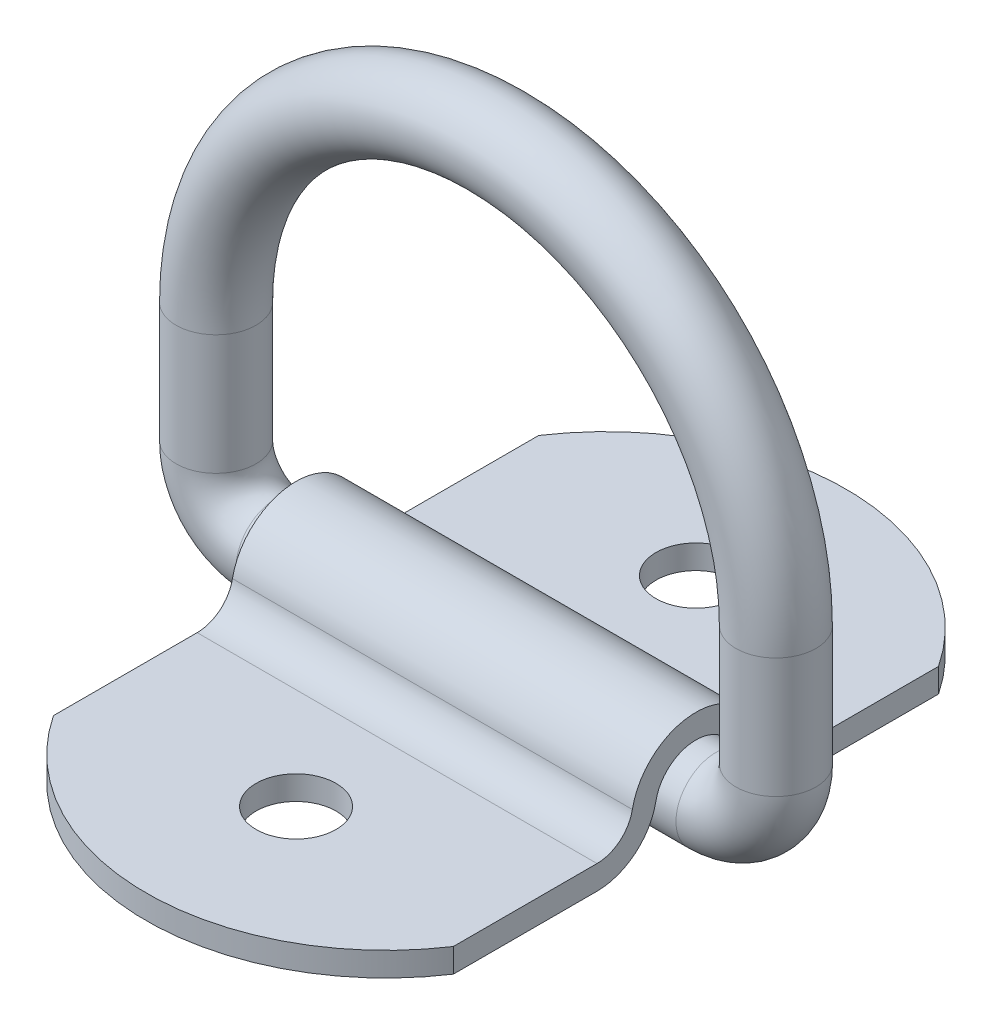
ISO-10303-21;
HEADER;
FILE_DESCRIPTION(('STEP AP214'),'2;1');
FILE_NAME('part.step','',(''),(''),'','','');
FILE_SCHEMA(('AUTOMOTIVE_DESIGN { 1 0 10303 214 1 1 1 1 }'));
ENDSEC;
DATA;
#1=APPLICATION_CONTEXT('core data for automotive mechanical design processes');
#2=APPLICATION_PROTOCOL_DEFINITION('international standard','automotive_design',2000,#1);
#3=PRODUCT_CONTEXT('',#1,'mechanical');
#4=PRODUCT('Part','Part','',(#3));
#5=PRODUCT_RELATED_PRODUCT_CATEGORY('part','',(#4));
#6=PRODUCT_DEFINITION_FORMATION('','',#4);
#7=PRODUCT_DEFINITION_CONTEXT('part definition',#1,'design');
#8=PRODUCT_DEFINITION('design','',#6,#7);
#9=PRODUCT_DEFINITION_SHAPE('','',#8);
#10=(LENGTH_UNIT() NAMED_UNIT(*) SI_UNIT(.MILLI.,.METRE.));
#11=(NAMED_UNIT(*) PLANE_ANGLE_UNIT() SI_UNIT($,.RADIAN.));
#12=(NAMED_UNIT(*) SI_UNIT($,.STERADIAN.) SOLID_ANGLE_UNIT());
#13=UNCERTAINTY_MEASURE_WITH_UNIT(LENGTH_MEASURE(1.E-05),#10,'distance_accuracy_value','');
#14=(GEOMETRIC_REPRESENTATION_CONTEXT(3) GLOBAL_UNCERTAINTY_ASSIGNED_CONTEXT((#13)) GLOBAL_UNIT_ASSIGNED_CONTEXT((#10,
#11,#12)) REPRESENTATION_CONTEXT('',''));
#15=CARTESIAN_POINT('',(0.,0.,0.));
#16=DIRECTION('',(0.,0.,1.));
#17=DIRECTION('',(1.,0.,0.));
#18=AXIS2_PLACEMENT_3D('',#15,#16,#17);
#19=CARTESIAN_POINT('',(15.875,-3.2385,27.78125));
#20=DIRECTION('',(0.,1.,0.));
#21=DIRECTION('',(0.,0.,1.));
#22=AXIS2_PLACEMENT_3D('',#19,#20,#21);
#23=PLANE('',#22);
#24=CARTESIAN_POINT('',(0.,-3.2385,15.875));
#25=DIRECTION('',(0.,-1.,0.));
#26=DIRECTION('',(0.,0.,-1.));
#27=AXIS2_PLACEMENT_3D('',#24,#25,#26);
#28=CIRCLE('',#27,3.175);
#29=CARTESIAN_POINT('',(0.,-3.2385,12.7));
#30=VERTEX_POINT('',#29);
#31=EDGE_CURVE('E217',#30,#30,#28,.T.);
#32=ORIENTED_EDGE('',*,*,#31,.F.);
#33=EDGE_LOOP('',(#32));
#34=FACE_BOUND('',#33,.T.);
#35=CARTESIAN_POINT('',(0.,-3.2385,8.73125));
#36=DIRECTION('',(0.,1.,0.));
#37=DIRECTION('',(0.,0.,-1.));
#38=AXIS2_PLACEMENT_3D('',#35,#36,#37);
#39=CIRCLE('',#38,19.05);
#40=CARTESIAN_POINT('',(-15.875,-3.2385,19.2615337093784));
#41=VERTEX_POINT('',#40);
#42=CARTESIAN_POINT('',(15.875,-3.2385,19.2615337093784));
#43=VERTEX_POINT('',#42);
#44=EDGE_CURVE('E216',#41,#43,#39,.T.);
#45=ORIENTED_EDGE('',*,*,#44,.F.);
#46=DIRECTION('',(0.,0.,-1.));
#47=VECTOR('',#46,1.);
#48=CARTESIAN_POINT('',(-15.875,-3.2385,27.78125));
#49=LINE('',#48,#47);
#50=CARTESIAN_POINT('',(-15.875,-3.2385,7.85451621680165));
#51=VERTEX_POINT('',#50);
#52=EDGE_CURVE('E170',#41,#51,#49,.T.);
#53=ORIENTED_EDGE('',*,*,#52,.T.);
#54=DIRECTION('',(-1.,0.,0.));
#55=VECTOR('',#54,1.);
#56=CARTESIAN_POINT('',(15.875,-3.2385,7.85451621680165));
#57=LINE('',#56,#55);
#58=CARTESIAN_POINT('',(15.875,-3.2385,7.85451621680165));
#59=VERTEX_POINT('',#58);
#60=EDGE_CURVE('E210',#59,#51,#57,.T.);
#61=ORIENTED_EDGE('',*,*,#60,.F.);
#62=DIRECTION('',(0.,0.,-1.));
#63=VECTOR('',#62,1.);
#64=CARTESIAN_POINT('',(15.875,-3.2385,27.78125));
#65=LINE('',#64,#63);
#66=EDGE_CURVE('E190',#43,#59,#65,.T.);
#67=ORIENTED_EDGE('',*,*,#66,.F.);
#68=EDGE_LOOP('',(#45,#53,#61,#67));
#69=FACE_BOUND('',#68,.T.);
#70=ADVANCED_FACE('F46',(#34,#69),#23,.F.);
#71=CARTESIAN_POINT('',(15.875,1.524,7.85451621680165));
#72=DIRECTION('',(-1.,0.,0.));
#73=DIRECTION('',(0.,0.,1.));
#74=AXIS2_PLACEMENT_3D('',#71,#72,#73);
#75=CYLINDRICAL_SURFACE('',#74,4.7625);
#76=CARTESIAN_POINT('',(-15.875,1.524,7.85451621680165));
#77=DIRECTION('',(1.,0.,0.));
#78=DIRECTION('',(0.,0.,-1.));
#79=AXIS2_PLACEMENT_3D('',#76,#77,#78);
#80=CIRCLE('',#79,4.7625);
#81=CARTESIAN_POINT('',(-15.875,0.616857142857142,3.1792089448959));
#82=VERTEX_POINT('',#81);
#83=EDGE_CURVE('E172',#51,#82,#80,.T.);
#84=ORIENTED_EDGE('',*,*,#83,.T.);
#85=DIRECTION('',(-1.,0.,0.));
#86=VECTOR('',#85,1.);
#87=CARTESIAN_POINT('',(15.875,0.616857142857142,3.1792089448959));
#88=LINE('',#87,#86);
#89=CARTESIAN_POINT('',(15.875,0.616857142857142,3.1792089448959));
#90=VERTEX_POINT('',#89);
#91=EDGE_CURVE('E207',#90,#82,#88,.T.);
#92=ORIENTED_EDGE('',*,*,#91,.F.);
#93=CARTESIAN_POINT('',(15.875,1.524,7.85451621680165));
#94=DIRECTION('',(1.,0.,0.));
#95=DIRECTION('',(0.,0.,-1.));
#96=AXIS2_PLACEMENT_3D('',#93,#94,#95);
#97=CIRCLE('',#96,4.7625);
#98=EDGE_CURVE('E237',#59,#90,#97,.T.);
#99=ORIENTED_EDGE('',*,*,#98,.F.);
#100=ORIENTED_EDGE('',*,*,#60,.T.);
#101=EDGE_LOOP('',(#84,#92,#99,#100));
#102=FACE_BOUND('',#101,.T.);
#103=ADVANCED_FACE('F280',(#102),#75,.T.);
#104=CARTESIAN_POINT('',(15.875,0.,0.));
#105=DIRECTION('',(-1.,0.,0.));
#106=DIRECTION('',(0.,0.,1.));
#107=AXIS2_PLACEMENT_3D('',#104,#105,#106);
#108=CYLINDRICAL_SURFACE('',#107,3.2385);
#109=CARTESIAN_POINT('',(-15.875,0.,0.));
#110=DIRECTION('',(-1.,0.,0.));
#111=DIRECTION('',(0.,0.,1.));
#112=AXIS2_PLACEMENT_3D('',#109,#110,#111);
#113=CIRCLE('',#112,3.2385);
#114=CARTESIAN_POINT('',(-15.875,0.61685714285714,-3.17920894489591));
#115=VERTEX_POINT('',#114);
#116=EDGE_CURVE('E174',#82,#115,#113,.T.);
#117=ORIENTED_EDGE('',*,*,#116,.T.);
#118=DIRECTION('',(-1.,0.,0.));
#119=VECTOR('',#118,1.);
#120=CARTESIAN_POINT('',(15.875,0.61685714285714,-3.17920894489591));
#121=LINE('',#120,#119);
#122=CARTESIAN_POINT('',(15.875,0.61685714285714,-3.17920894489591));
#123=VERTEX_POINT('',#122);
#124=EDGE_CURVE('E204',#123,#115,#121,.T.);
#125=ORIENTED_EDGE('',*,*,#124,.F.);
#126=CARTESIAN_POINT('',(15.875,0.,0.));
#127=DIRECTION('',(-1.,0.,0.));
#128=DIRECTION('',(0.,0.,1.));
#129=AXIS2_PLACEMENT_3D('',#126,#127,#128);
#130=CIRCLE('',#129,3.2385);
#131=EDGE_CURVE('E157',#90,#123,#130,.T.);
#132=ORIENTED_EDGE('',*,*,#131,.F.);
#133=ORIENTED_EDGE('',*,*,#91,.T.);
#134=EDGE_LOOP('',(#117,#125,#132,#133));
#135=FACE_BOUND('',#134,.T.);
#136=ADVANCED_FACE('F243',(#135),#108,.F.);
#137=CARTESIAN_POINT('',(15.875,1.524,-7.85451621680165));
#138=DIRECTION('',(-1.,0.,0.));
#139=DIRECTION('',(0.,0.,1.));
#140=AXIS2_PLACEMENT_3D('',#137,#138,#139);
#141=CYLINDRICAL_SURFACE('',#140,4.7625);
#142=CARTESIAN_POINT('',(-15.875,1.524,-7.85451621680165));
#143=DIRECTION('',(1.,0.,0.));
#144=DIRECTION('',(0.,0.,1.));
#145=AXIS2_PLACEMENT_3D('',#142,#143,#144);
#146=CIRCLE('',#145,4.7625);
#147=CARTESIAN_POINT('',(-15.875,-3.2385,-7.85451621680165));
#148=VERTEX_POINT('',#147);
#149=EDGE_CURVE('E176',#115,#148,#146,.T.);
#150=ORIENTED_EDGE('',*,*,#149,.T.);
#151=DIRECTION('',(-1.,0.,0.));
#152=VECTOR('',#151,1.);
#153=CARTESIAN_POINT('',(15.875,-3.2385,-7.85451621680165));
#154=LINE('',#153,#152);
#155=CARTESIAN_POINT('',(15.875,-3.2385,-7.85451621680165));
#156=VERTEX_POINT('',#155);
#157=EDGE_CURVE('E202',#156,#148,#154,.T.);
#158=ORIENTED_EDGE('',*,*,#157,.F.);
#159=CARTESIAN_POINT('',(15.875,1.524,-7.85451621680165));
#160=DIRECTION('',(1.,0.,0.));
#161=DIRECTION('',(0.,0.,1.));
#162=AXIS2_PLACEMENT_3D('',#159,#160,#161);
#163=CIRCLE('',#162,4.7625);
#164=EDGE_CURVE('E151',#123,#156,#163,.T.);
#165=ORIENTED_EDGE('',*,*,#164,.F.);
#166=ORIENTED_EDGE('',*,*,#124,.T.);
#167=EDGE_LOOP('',(#150,#158,#165,#166));
#168=FACE_BOUND('',#167,.T.);
#169=ADVANCED_FACE('F247',(#168),#141,.T.);
#170=CARTESIAN_POINT('',(15.875,-3.23849999999999,-27.78125));
#171=DIRECTION('',(0.,1.,0.));
#172=DIRECTION('',(0.,0.,1.));
#173=AXIS2_PLACEMENT_3D('',#170,#171,#172);
#174=PLANE('',#173);
#175=CARTESIAN_POINT('',(0.,-3.2385,-15.875));
#176=DIRECTION('',(0.,-1.,0.));
#177=DIRECTION('',(0.,0.,1.));
#178=AXIS2_PLACEMENT_3D('',#175,#176,#177);
#179=CIRCLE('',#178,3.175);
#180=CARTESIAN_POINT('',(0.,-3.2385,-12.7));
#181=VERTEX_POINT('',#180);
#182=EDGE_CURVE('E220',#181,#181,#179,.T.);
#183=ORIENTED_EDGE('',*,*,#182,.F.);
#184=EDGE_LOOP('',(#183));
#185=FACE_BOUND('',#184,.T.);
#186=DIRECTION('',(0.,0.,-1.));
#187=VECTOR('',#186,1.);
#188=CARTESIAN_POINT('',(-15.875,-3.23849999999999,-27.78125));
#189=LINE('',#188,#187);
#190=CARTESIAN_POINT('',(-15.875,-3.23849999999999,-19.2615337093784));
#191=VERTEX_POINT('',#190);
#192=EDGE_CURVE('E147',#148,#191,#189,.T.);
#193=ORIENTED_EDGE('',*,*,#192,.T.);
#194=CARTESIAN_POINT('',(0.,-3.2385,-8.73125));
#195=DIRECTION('',(0.,1.,0.));
#196=DIRECTION('',(0.,0.,1.));
#197=AXIS2_PLACEMENT_3D('',#194,#195,#196);
#198=CIRCLE('',#197,19.05);
#199=CARTESIAN_POINT('',(15.875,-3.2385,-19.2615337093784));
#200=VERTEX_POINT('',#199);
#201=EDGE_CURVE('E60',#200,#191,#198,.T.);
#202=ORIENTED_EDGE('',*,*,#201,.F.);
#203=DIRECTION('',(0.,0.,-1.));
#204=VECTOR('',#203,1.);
#205=CARTESIAN_POINT('',(15.875,-3.23849999999999,-27.78125));
#206=LINE('',#205,#204);
#207=EDGE_CURVE('E145',#156,#200,#206,.T.);
#208=ORIENTED_EDGE('',*,*,#207,.F.);
#209=ORIENTED_EDGE('',*,*,#157,.T.);
#210=EDGE_LOOP('',(#193,#202,#208,#209));
#211=FACE_BOUND('',#210,.T.);
#212=ADVANCED_FACE('F143',(#185,#211),#174,.F.);
#213=CARTESIAN_POINT('',(15.875,-1.33349999999999,-27.78125));
#214=DIRECTION('',(0.,-1.,0.));
#215=DIRECTION('',(0.,0.,-1.));
#216=AXIS2_PLACEMENT_3D('',#213,#214,#215);
#217=PLANE('',#216);
#218=CARTESIAN_POINT('',(0.,-1.33349999999999,-15.875));
#219=DIRECTION('',(0.,-1.,0.));
#220=DIRECTION('',(0.,0.,-1.));
#221=AXIS2_PLACEMENT_3D('',#218,#219,#220);
#222=CIRCLE('',#221,3.175);
#223=CARTESIAN_POINT('',(0.,-1.33349999999999,-19.05));
#224=VERTEX_POINT('',#223);
#225=EDGE_CURVE('E218',#224,#224,#222,.T.);
#226=ORIENTED_EDGE('',*,*,#225,.T.);
#227=EDGE_LOOP('',(#226));
#228=FACE_BOUND('',#227,.T.);
#229=DIRECTION('',(0.,0.,1.));
#230=VECTOR('',#229,1.);
#231=CARTESIAN_POINT('',(15.875,-1.33349999999999,-27.78125));
#232=LINE('',#231,#230);
#233=CARTESIAN_POINT('',(15.875,-1.33349999999999,-19.2615337093784));
#234=VERTEX_POINT('',#233);
#235=CARTESIAN_POINT('',(15.875,-1.3335,-7.85451621680165));
#236=VERTEX_POINT('',#235);
#237=EDGE_CURVE('E153',#234,#236,#232,.T.);
#238=ORIENTED_EDGE('',*,*,#237,.F.);
#239=CARTESIAN_POINT('',(0.,-1.3335,-8.73125));
#240=DIRECTION('',(0.,-1.,0.));
#241=DIRECTION('',(0.,0.,-1.));
#242=AXIS2_PLACEMENT_3D('',#239,#240,#241);
#243=CIRCLE('',#242,19.05);
#244=CARTESIAN_POINT('',(-15.875,-1.33349999999999,-19.2615337093784));
#245=VERTEX_POINT('',#244);
#246=EDGE_CURVE('E135',#234,#245,#243,.F.);
#247=ORIENTED_EDGE('',*,*,#246,.T.);
#248=DIRECTION('',(0.,0.,1.));
#249=VECTOR('',#248,1.);
#250=CARTESIAN_POINT('',(-15.875,-1.33349999999999,-27.78125));
#251=LINE('',#250,#249);
#252=CARTESIAN_POINT('',(-15.875,-1.3335,-7.85451621680165));
#253=VERTEX_POINT('',#252);
#254=EDGE_CURVE('E179',#245,#253,#251,.T.);
#255=ORIENTED_EDGE('',*,*,#254,.T.);
#256=DIRECTION('',(-1.,0.,0.));
#257=VECTOR('',#256,1.);
#258=CARTESIAN_POINT('',(15.875,-1.3335,-7.85451621680165));
#259=LINE('',#258,#257);
#260=EDGE_CURVE('E199',#236,#253,#259,.T.);
#261=ORIENTED_EDGE('',*,*,#260,.F.);
#262=EDGE_LOOP('',(#238,#247,#255,#261));
#263=FACE_BOUND('',#262,.T.);
#264=ADVANCED_FACE('F253',(#228,#263),#217,.F.);
#265=CARTESIAN_POINT('',(15.875,1.524,-7.85451621680165));
#266=DIRECTION('',(-1.,0.,0.));
#267=DIRECTION('',(0.,0.,1.));
#268=AXIS2_PLACEMENT_3D('',#265,#266,#267);
#269=CYLINDRICAL_SURFACE('',#268,2.8575);
#270=CARTESIAN_POINT('',(-15.875,1.524,-7.85451621680165));
#271=DIRECTION('',(-1.,0.,0.));
#272=DIRECTION('',(0.,0.,1.));
#273=AXIS2_PLACEMENT_3D('',#270,#271,#272);
#274=CIRCLE('',#273,2.8575);
#275=CARTESIAN_POINT('',(-15.875,0.979714285714286,-5.0493318536582));
#276=VERTEX_POINT('',#275);
#277=EDGE_CURVE('E181',#253,#276,#274,.T.);
#278=ORIENTED_EDGE('',*,*,#277,.T.);
#279=DIRECTION('',(-1.,0.,0.));
#280=VECTOR('',#279,1.);
#281=CARTESIAN_POINT('',(15.875,0.979714285714286,-5.0493318536582));
#282=LINE('',#281,#280);
#283=CARTESIAN_POINT('',(15.875,0.979714285714286,-5.0493318536582));
#284=VERTEX_POINT('',#283);
#285=EDGE_CURVE('E196',#284,#276,#282,.T.);
#286=ORIENTED_EDGE('',*,*,#285,.F.);
#287=CARTESIAN_POINT('',(15.875,1.524,-7.85451621680165));
#288=DIRECTION('',(-1.,0.,0.));
#289=DIRECTION('',(0.,0.,1.));
#290=AXIS2_PLACEMENT_3D('',#287,#288,#289);
#291=CIRCLE('',#290,2.8575);
#292=EDGE_CURVE('E155',#236,#284,#291,.T.);
#293=ORIENTED_EDGE('',*,*,#292,.F.);
#294=ORIENTED_EDGE('',*,*,#260,.T.);
#295=EDGE_LOOP('',(#278,#286,#293,#294));
#296=FACE_BOUND('',#295,.T.);
#297=ADVANCED_FACE('F260',(#296),#269,.F.);
#298=CARTESIAN_POINT('',(15.875,0.,0.));
#299=DIRECTION('',(-1.,0.,0.));
#300=DIRECTION('',(0.,0.,1.));
#301=AXIS2_PLACEMENT_3D('',#298,#299,#300);
#302=CYLINDRICAL_SURFACE('',#301,5.1435);
#303=CARTESIAN_POINT('',(-15.875,0.,0.));
#304=DIRECTION('',(1.,0.,0.));
#305=DIRECTION('',(0.,0.,1.));
#306=AXIS2_PLACEMENT_3D('',#303,#304,#305);
#307=CIRCLE('',#306,5.1435);
#308=CARTESIAN_POINT('',(-15.875,0.979714285714285,5.0493318536582));
#309=VERTEX_POINT('',#308);
#310=EDGE_CURVE('E183',#276,#309,#307,.T.);
#311=ORIENTED_EDGE('',*,*,#310,.T.);
#312=DIRECTION('',(-1.,0.,0.));
#313=VECTOR('',#312,1.);
#314=CARTESIAN_POINT('',(15.875,0.979714285714285,5.0493318536582));
#315=LINE('',#314,#313);
#316=CARTESIAN_POINT('',(15.875,0.979714285714285,5.0493318536582));
#317=VERTEX_POINT('',#316);
#318=EDGE_CURVE('E193',#317,#309,#315,.T.);
#319=ORIENTED_EDGE('',*,*,#318,.F.);
#320=CARTESIAN_POINT('',(15.875,0.,0.));
#321=DIRECTION('',(1.,0.,0.));
#322=DIRECTION('',(0.,0.,1.));
#323=AXIS2_PLACEMENT_3D('',#320,#321,#322);
#324=CIRCLE('',#323,5.1435);
#325=EDGE_CURVE('E162',#284,#317,#324,.T.);
#326=ORIENTED_EDGE('',*,*,#325,.F.);
#327=ORIENTED_EDGE('',*,*,#285,.T.);
#328=EDGE_LOOP('',(#311,#319,#326,#327));
#329=FACE_BOUND('',#328,.T.);
#330=ADVANCED_FACE('F263',(#329),#302,.T.);
#331=CARTESIAN_POINT('',(15.875,1.524,7.85451621680165));
#332=DIRECTION('',(-1.,0.,0.));
#333=DIRECTION('',(0.,0.,1.));
#334=AXIS2_PLACEMENT_3D('',#331,#332,#333);
#335=CYLINDRICAL_SURFACE('',#334,2.8575);
#336=CARTESIAN_POINT('',(-15.875,1.524,7.85451621680165));
#337=DIRECTION('',(-1.,0.,0.));
#338=DIRECTION('',(0.,0.,-1.));
#339=AXIS2_PLACEMENT_3D('',#336,#337,#338);
#340=CIRCLE('',#339,2.8575);
#341=CARTESIAN_POINT('',(-15.875,-1.3335,7.85451621680165));
#342=VERTEX_POINT('',#341);
#343=EDGE_CURVE('E185',#309,#342,#340,.T.);
#344=ORIENTED_EDGE('',*,*,#343,.T.);
#345=DIRECTION('',(-1.,0.,0.));
#346=VECTOR('',#345,1.);
#347=CARTESIAN_POINT('',(15.875,-1.3335,7.85451621680165));
#348=LINE('',#347,#346);
#349=CARTESIAN_POINT('',(15.875,-1.3335,7.85451621680165));
#350=VERTEX_POINT('',#349);
#351=EDGE_CURVE('E169',#350,#342,#348,.T.);
#352=ORIENTED_EDGE('',*,*,#351,.F.);
#353=CARTESIAN_POINT('',(15.875,1.524,7.85451621680165));
#354=DIRECTION('',(-1.,0.,0.));
#355=DIRECTION('',(0.,0.,-1.));
#356=AXIS2_PLACEMENT_3D('',#353,#354,#355);
#357=CIRCLE('',#356,2.8575);
#358=EDGE_CURVE('E164',#317,#350,#357,.T.);
#359=ORIENTED_EDGE('',*,*,#358,.F.);
#360=ORIENTED_EDGE('',*,*,#318,.T.);
#361=EDGE_LOOP('',(#344,#352,#359,#360));
#362=FACE_BOUND('',#361,.T.);
#363=ADVANCED_FACE('F268',(#362),#335,.F.);
#364=CARTESIAN_POINT('',(15.875,-1.3335,27.78125));
#365=DIRECTION('',(0.,-1.,0.));
#366=DIRECTION('',(0.,0.,-1.));
#367=AXIS2_PLACEMENT_3D('',#364,#365,#366);
#368=PLANE('',#367);
#369=CARTESIAN_POINT('',(0.,-1.3335,15.875));
#370=DIRECTION('',(0.,-1.,0.));
#371=DIRECTION('',(0.,0.,-1.));
#372=AXIS2_PLACEMENT_3D('',#369,#370,#371);
#373=CIRCLE('',#372,3.175);
#374=CARTESIAN_POINT('',(0.,-1.3335,12.7));
#375=VERTEX_POINT('',#374);
#376=EDGE_CURVE('E214',#375,#375,#373,.T.);
#377=ORIENTED_EDGE('',*,*,#376,.T.);
#378=EDGE_LOOP('',(#377));
#379=FACE_BOUND('',#378,.T.);
#380=DIRECTION('',(0.,0.,1.));
#381=VECTOR('',#380,1.);
#382=CARTESIAN_POINT('',(-15.875,-1.3335,27.78125));
#383=LINE('',#382,#381);
#384=CARTESIAN_POINT('',(-15.875,-1.3335,19.2615337093784));
#385=VERTEX_POINT('',#384);
#386=EDGE_CURVE('E187',#342,#385,#383,.T.);
#387=ORIENTED_EDGE('',*,*,#386,.T.);
#388=CARTESIAN_POINT('',(0.,-1.3335,8.73125));
#389=DIRECTION('',(0.,-1.,0.));
#390=DIRECTION('',(0.,0.,-1.));
#391=AXIS2_PLACEMENT_3D('',#388,#389,#390);
#392=CIRCLE('',#391,19.05);
#393=CARTESIAN_POINT('',(15.875,-1.3335,19.2615337093784));
#394=VERTEX_POINT('',#393);
#395=EDGE_CURVE('E67',#385,#394,#392,.F.);
#396=ORIENTED_EDGE('',*,*,#395,.T.);
#397=DIRECTION('',(0.,0.,1.));
#398=VECTOR('',#397,1.);
#399=CARTESIAN_POINT('',(15.875,-1.3335,27.78125));
#400=LINE('',#399,#398);
#401=EDGE_CURVE('E166',#350,#394,#400,.T.);
#402=ORIENTED_EDGE('',*,*,#401,.F.);
#403=ORIENTED_EDGE('',*,*,#351,.T.);
#404=EDGE_LOOP('',(#387,#396,#402,#403));
#405=FACE_BOUND('',#404,.T.);
#406=ADVANCED_FACE('F272',(#379,#405),#368,.F.);
#407=CARTESIAN_POINT('',(15.875,1.524,7.85451621680165));
#408=DIRECTION('',(1.,0.,0.));
#409=DIRECTION('',(0.,0.,-1.));
#410=AXIS2_PLACEMENT_3D('',#407,#408,#409);
#411=PLANE('',#410);
#412=DIRECTION('',(0.,-1.,0.));
#413=VECTOR('',#412,1.);
#414=CARTESIAN_POINT('',(15.875,39.6874999999999,-19.2615337093784));
#415=LINE('',#414,#413);
#416=EDGE_CURVE('E132',#234,#200,#415,.T.);
#417=ORIENTED_EDGE('',*,*,#416,.F.);
#418=ORIENTED_EDGE('',*,*,#237,.T.);
#419=ORIENTED_EDGE('',*,*,#292,.T.);
#420=ORIENTED_EDGE('',*,*,#325,.T.);
#421=ORIENTED_EDGE('',*,*,#358,.T.);
#422=ORIENTED_EDGE('',*,*,#401,.T.);
#423=DIRECTION('',(0.,-1.,0.));
#424=VECTOR('',#423,1.);
#425=CARTESIAN_POINT('',(15.875,39.6874999999999,19.2615337093784));
#426=LINE('',#425,#424);
#427=EDGE_CURVE('E232',#394,#43,#426,.T.);
#428=ORIENTED_EDGE('',*,*,#427,.T.);
#429=ORIENTED_EDGE('',*,*,#66,.T.);
#430=ORIENTED_EDGE('',*,*,#98,.T.);
#431=ORIENTED_EDGE('',*,*,#131,.T.);
#432=ORIENTED_EDGE('',*,*,#164,.T.);
#433=ORIENTED_EDGE('',*,*,#207,.T.);
#434=EDGE_LOOP('',(#417,#418,#419,#420,#421,#422,#428,#429,#430,#431,#432,#433));
#435=FACE_BOUND('',#434,.T.);
#436=ADVANCED_FACE('F149',(#435),#411,.T.);
#437=CARTESIAN_POINT('',(-15.875,1.524,7.85451621680165));
#438=DIRECTION('',(1.,0.,0.));
#439=DIRECTION('',(0.,0.,-1.));
#440=AXIS2_PLACEMENT_3D('',#437,#438,#439);
#441=PLANE('',#440);
#442=ORIENTED_EDGE('',*,*,#254,.F.);
#443=DIRECTION('',(0.,-1.,0.));
#444=VECTOR('',#443,1.);
#445=CARTESIAN_POINT('',(-15.875,39.6874999999999,-19.2615337093784));
#446=LINE('',#445,#444);
#447=EDGE_CURVE('E12',#245,#191,#446,.T.);
#448=ORIENTED_EDGE('',*,*,#447,.T.);
#449=ORIENTED_EDGE('',*,*,#192,.F.);
#450=ORIENTED_EDGE('',*,*,#149,.F.);
#451=ORIENTED_EDGE('',*,*,#116,.F.);
#452=ORIENTED_EDGE('',*,*,#83,.F.);
#453=ORIENTED_EDGE('',*,*,#52,.F.);
#454=DIRECTION('',(0.,-1.,0.));
#455=VECTOR('',#454,1.);
#456=CARTESIAN_POINT('',(-15.875,39.6874999999999,19.2615337093784));
#457=LINE('',#456,#455);
#458=EDGE_CURVE('E53',#41,#385,#457,.F.);
#459=ORIENTED_EDGE('',*,*,#458,.T.);
#460=ORIENTED_EDGE('',*,*,#386,.F.);
#461=ORIENTED_EDGE('',*,*,#343,.F.);
#462=ORIENTED_EDGE('',*,*,#310,.F.);
#463=ORIENTED_EDGE('',*,*,#277,.F.);
#464=EDGE_LOOP('',(#442,#448,#449,#450,#451,#452,#453,#459,#460,#461,#462,#463));
#465=FACE_BOUND('',#464,.T.);
#466=ADVANCED_FACE('F250',(#465),#441,.F.);
#467=CARTESIAN_POINT('',(0.,39.6874999999999,8.73125));
#468=DIRECTION('',(0.,-1.,0.));
#469=DIRECTION('',(0.,0.,-1.));
#470=AXIS2_PLACEMENT_3D('',#467,#468,#469);
#471=CYLINDRICAL_SURFACE('',#470,19.05);
#472=ORIENTED_EDGE('',*,*,#458,.F.);
#473=ORIENTED_EDGE('',*,*,#44,.T.);
#474=ORIENTED_EDGE('',*,*,#427,.F.);
#475=ORIENTED_EDGE('',*,*,#395,.F.);
#476=EDGE_LOOP('',(#472,#473,#474,#475));
#477=FACE_BOUND('',#476,.T.);
#478=ADVANCED_FACE('F274',(#477),#471,.T.);
#479=CARTESIAN_POINT('',(0.,39.6874999999999,15.875));
#480=DIRECTION('',(0.,-1.,0.));
#481=DIRECTION('',(0.,0.,-1.));
#482=AXIS2_PLACEMENT_3D('',#479,#480,#481);
#483=CYLINDRICAL_SURFACE('',#482,3.175);
#484=ORIENTED_EDGE('',*,*,#31,.T.);
#485=EDGE_LOOP('',(#484));
#486=FACE_BOUND('',#485,.T.);
#487=ORIENTED_EDGE('',*,*,#376,.F.);
#488=EDGE_LOOP('',(#487));
#489=FACE_BOUND('',#488,.T.);
#490=ADVANCED_FACE('F311',(#486,#489),#483,.F.);
#491=CARTESIAN_POINT('',(0.,39.6874999999999,-15.875));
#492=DIRECTION('',(0.,-1.,0.));
#493=DIRECTION('',(0.,0.,-1.));
#494=AXIS2_PLACEMENT_3D('',#491,#492,#493);
#495=CYLINDRICAL_SURFACE('',#494,3.175);
#496=ORIENTED_EDGE('',*,*,#182,.T.);
#497=EDGE_LOOP('',(#496));
#498=FACE_BOUND('',#497,.T.);
#499=ORIENTED_EDGE('',*,*,#225,.F.);
#500=EDGE_LOOP('',(#499));
#501=FACE_BOUND('',#500,.T.);
#502=ADVANCED_FACE('F314',(#498,#501),#495,.F.);
#503=CARTESIAN_POINT('',(0.,39.6874999999999,-8.73124999999999));
#504=DIRECTION('',(0.,-1.,0.));
#505=DIRECTION('',(0.,0.,-1.));
#506=AXIS2_PLACEMENT_3D('',#503,#504,#505);
#507=CYLINDRICAL_SURFACE('',#506,19.05);
#508=ORIENTED_EDGE('',*,*,#201,.T.);
#509=ORIENTED_EDGE('',*,*,#447,.F.);
#510=ORIENTED_EDGE('',*,*,#246,.F.);
#511=ORIENTED_EDGE('',*,*,#416,.T.);
#512=EDGE_LOOP('',(#508,#509,#510,#511));
#513=FACE_BOUND('',#512,.T.);
#514=ADVANCED_FACE('F133',(#513),#507,.T.);
#515=CLOSED_SHELL('',(#70,#103,#136,#169,#212,#264,#297,#330,#363,#406,#436,#466,#478,#490,#502,#514));
#516=MANIFOLD_SOLID_BREP('B2',#515);
#517=CARTESIAN_POINT('',(17.4625,4.7625,0.));
#518=DIRECTION('',(0.,0.,-1.));
#519=DIRECTION('',(-1.,0.,0.));
#520=AXIS2_PLACEMENT_3D('',#517,#518,#519);
#521=TOROIDAL_SURFACE('',#520,4.7625,3.175);
#522=CARTESIAN_POINT('',(22.225,4.7625,0.));
#523=DIRECTION('',(0.,1.,0.));
#524=DIRECTION('',(0.,0.,-1.));
#525=AXIS2_PLACEMENT_3D('',#522,#523,#524);
#526=CIRCLE('',#525,3.175);
#527=CARTESIAN_POINT('',(25.4,4.7625,0.));
#528=VERTEX_POINT('',#527);
#529=EDGE_CURVE('E431',#528,#528,#526,.T.);
#530=CARTESIAN_POINT('',(17.4625,0.,0.));
#531=DIRECTION('',(1.,0.,0.));
#532=DIRECTION('',(0.,0.,-1.));
#533=AXIS2_PLACEMENT_3D('',#530,#531,#532);
#534=CIRCLE('',#533,3.175);
#535=CARTESIAN_POINT('',(17.4625,-3.175,0.));
#536=VERTEX_POINT('',#535);
#537=EDGE_CURVE('E45',#536,#536,#534,.T.);
#538=CARTESIAN_POINT('',(17.4625,4.7625,0.));
#539=DIRECTION('',(0.,0.,-1.));
#540=DIRECTION('',(-1.,0.,0.));
#541=AXIS2_PLACEMENT_3D('',#538,#539,#540);
#542=CIRCLE('',#541,7.9375);
#543=EDGE_CURVE('',#528,#536,#542,.T.);
#544=ORIENTED_EDGE('',*,*,#529,.F.);
#545=ORIENTED_EDGE('',*,*,#537,.T.);
#546=ORIENTED_EDGE('',*,*,#543,.T.);
#547=ORIENTED_EDGE('',*,*,#543,.F.);
#548=EDGE_LOOP('',(#544,#546,#545,#547));
#549=FACE_BOUND('',#548,.T.);
#550=ADVANCED_FACE('F425',(#549),#521,.T.);
#551=CARTESIAN_POINT('',(22.225,14.2874999999999,0.));
#552=DIRECTION('',(0.,-1.,0.));
#553=DIRECTION('',(0.,0.,-1.));
#554=AXIS2_PLACEMENT_3D('',#551,#552,#553);
#555=CYLINDRICAL_SURFACE('',#554,3.175);
#556=CARTESIAN_POINT('',(22.225,14.2874999999999,0.));
#557=DIRECTION('',(0.,1.,0.));
#558=DIRECTION('',(0.,0.,-1.));
#559=AXIS2_PLACEMENT_3D('',#556,#557,#558);
#560=CIRCLE('',#559,3.175);
#561=CARTESIAN_POINT('',(25.4,14.2874999999999,0.));
#562=VERTEX_POINT('',#561);
#563=EDGE_CURVE('E435',#562,#562,#560,.T.);
#564=ORIENTED_EDGE('',*,*,#563,.F.);
#565=EDGE_LOOP('',(#564));
#566=FACE_BOUND('',#565,.T.);
#567=ORIENTED_EDGE('',*,*,#529,.T.);
#568=EDGE_LOOP('',(#567));
#569=FACE_BOUND('',#568,.T.);
#570=ADVANCED_FACE('F469',(#566,#569),#555,.T.);
#571=CARTESIAN_POINT('',(0.,14.2874999999999,0.));
#572=DIRECTION('',(0.,0.,-1.));
#573=DIRECTION('',(-1.,0.,0.));
#574=AXIS2_PLACEMENT_3D('',#571,#572,#573);
#575=TOROIDAL_SURFACE('',#574,22.225,3.175);
#576=CARTESIAN_POINT('',(-22.225,14.2875,0.));
#577=DIRECTION('',(0.,-1.,0.));
#578=DIRECTION('',(0.,0.,-1.));
#579=AXIS2_PLACEMENT_3D('',#576,#577,#578);
#580=CIRCLE('',#579,3.175);
#581=CARTESIAN_POINT('',(-25.4,14.2875,0.));
#582=VERTEX_POINT('',#581);
#583=EDGE_CURVE('E439',#582,#582,#580,.T.);
#584=CARTESIAN_POINT('',(0.,14.2874999999999,0.));
#585=DIRECTION('',(0.,0.,-1.));
#586=DIRECTION('',(-1.,0.,0.));
#587=AXIS2_PLACEMENT_3D('',#584,#585,#586);
#588=CIRCLE('',#587,25.4);
#589=EDGE_CURVE('',#582,#562,#588,.T.);
#590=ORIENTED_EDGE('',*,*,#583,.F.);
#591=ORIENTED_EDGE('',*,*,#563,.T.);
#592=ORIENTED_EDGE('',*,*,#589,.T.);
#593=ORIENTED_EDGE('',*,*,#589,.F.);
#594=EDGE_LOOP('',(#590,#592,#591,#593));
#595=FACE_BOUND('',#594,.T.);
#596=ADVANCED_FACE('F463',(#595),#575,.T.);
#597=CARTESIAN_POINT('',(-22.225,4.76250000000001,0.));
#598=DIRECTION('',(0.,1.,0.));
#599=DIRECTION('',(0.,0.,1.));
#600=AXIS2_PLACEMENT_3D('',#597,#598,#599);
#601=CYLINDRICAL_SURFACE('',#600,3.175);
#602=CARTESIAN_POINT('',(-22.225,4.76250000000001,0.));
#603=DIRECTION('',(0.,-1.,0.));
#604=DIRECTION('',(0.,0.,-1.));
#605=AXIS2_PLACEMENT_3D('',#602,#603,#604);
#606=CIRCLE('',#605,3.175);
#607=CARTESIAN_POINT('',(-25.4,4.76250000000001,0.));
#608=VERTEX_POINT('',#607);
#609=EDGE_CURVE('E444',#608,#608,#606,.T.);
#610=ORIENTED_EDGE('',*,*,#609,.F.);
#611=EDGE_LOOP('',(#610));
#612=FACE_BOUND('',#611,.T.);
#613=ORIENTED_EDGE('',*,*,#583,.T.);
#614=EDGE_LOOP('',(#613));
#615=FACE_BOUND('',#614,.T.);
#616=ADVANCED_FACE('F457',(#612,#615),#601,.T.);
#617=CARTESIAN_POINT('',(-17.4625,4.7625,0.));
#618=DIRECTION('',(0.,0.,-1.));
#619=DIRECTION('',(-1.,0.,0.));
#620=AXIS2_PLACEMENT_3D('',#617,#618,#619);
#621=TOROIDAL_SURFACE('',#620,4.7625,3.175);
#622=CARTESIAN_POINT('',(-17.4625,0.,0.));
#623=DIRECTION('',(1.,0.,0.));
#624=DIRECTION('',(0.,0.,-1.));
#625=AXIS2_PLACEMENT_3D('',#622,#623,#624);
#626=CIRCLE('',#625,3.175);
#627=CARTESIAN_POINT('',(-17.4625,-3.175,0.));
#628=VERTEX_POINT('',#627);
#629=EDGE_CURVE('E447',#628,#628,#626,.T.);
#630=CARTESIAN_POINT('',(-17.4625,4.7625,0.));
#631=DIRECTION('',(0.,0.,-1.));
#632=DIRECTION('',(-1.,0.,0.));
#633=AXIS2_PLACEMENT_3D('',#630,#631,#632);
#634=CIRCLE('',#633,7.9375);
#635=EDGE_CURVE('',#628,#608,#634,.T.);
#636=ORIENTED_EDGE('',*,*,#629,.F.);
#637=ORIENTED_EDGE('',*,*,#609,.T.);
#638=ORIENTED_EDGE('',*,*,#635,.T.);
#639=ORIENTED_EDGE('',*,*,#635,.F.);
#640=EDGE_LOOP('',(#636,#638,#637,#639));
#641=FACE_BOUND('',#640,.T.);
#642=ADVANCED_FACE('F454',(#641),#621,.T.);
#643=CARTESIAN_POINT('',(-17.4625,0.,0.));
#644=DIRECTION('',(1.,0.,0.));
#645=DIRECTION('',(0.,0.,-1.));
#646=AXIS2_PLACEMENT_3D('',#643,#644,#645);
#647=CYLINDRICAL_SURFACE('',#646,3.175);
#648=ORIENTED_EDGE('',*,*,#629,.T.);
#649=EDGE_LOOP('',(#648));
#650=FACE_BOUND('',#649,.T.);
#651=ORIENTED_EDGE('',*,*,#537,.F.);
#652=EDGE_LOOP('',(#651));
#653=FACE_BOUND('',#652,.T.);
#654=ADVANCED_FACE('F451',(#650,#653),#647,.T.);
#655=CLOSED_SHELL('',(#550,#570,#596,#616,#642,#654));
#656=MANIFOLD_SOLID_BREP('B6',#655);
#657=ADVANCED_BREP_SHAPE_REPRESENTATION('',(#18,#516,#656),#14);
#658=SHAPE_DEFINITION_REPRESENTATION(#9,#657);
ENDSEC;
END-ISO-10303-21;
